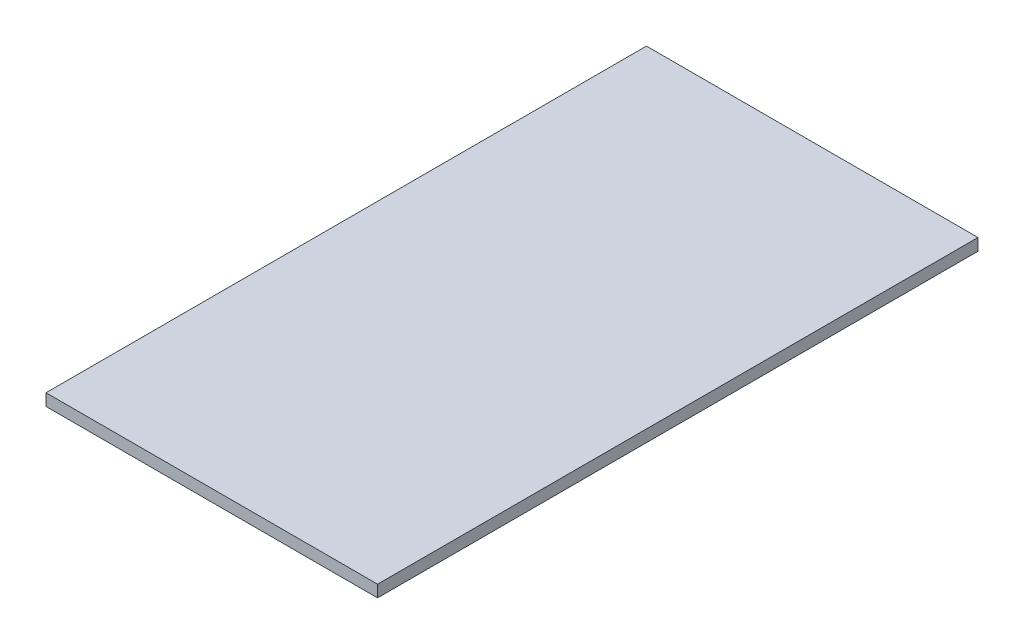
ISO-10303-21;
HEADER;
FILE_DESCRIPTION(('STEP AP214'),'2;1');
FILE_NAME('part.step','',(''),(''),'','','');
FILE_SCHEMA(('AUTOMOTIVE_DESIGN { 1 0 10303 214 1 1 1 1 }'));
ENDSEC;
DATA;
#1=APPLICATION_CONTEXT('core data for automotive mechanical design processes');
#2=APPLICATION_PROTOCOL_DEFINITION('international standard','automotive_design',2000,#1);
#3=PRODUCT_CONTEXT('',#1,'mechanical');
#4=PRODUCT('Part','Part','',(#3));
#5=PRODUCT_RELATED_PRODUCT_CATEGORY('part','',(#4));
#6=PRODUCT_DEFINITION_FORMATION('','',#4);
#7=PRODUCT_DEFINITION_CONTEXT('part definition',#1,'design');
#8=PRODUCT_DEFINITION('design','',#6,#7);
#9=PRODUCT_DEFINITION_SHAPE('','',#8);
#10=(LENGTH_UNIT() NAMED_UNIT(*) SI_UNIT(.MILLI.,.METRE.));
#11=(NAMED_UNIT(*) PLANE_ANGLE_UNIT() SI_UNIT($,.RADIAN.));
#12=(NAMED_UNIT(*) SI_UNIT($,.STERADIAN.) SOLID_ANGLE_UNIT());
#13=UNCERTAINTY_MEASURE_WITH_UNIT(LENGTH_MEASURE(1.E-05),#10,'distance_accuracy_value','');
#14=(GEOMETRIC_REPRESENTATION_CONTEXT(3) GLOBAL_UNCERTAINTY_ASSIGNED_CONTEXT((#13)) GLOBAL_UNIT_ASSIGNED_CONTEXT((#10,
#11,#12)) REPRESENTATION_CONTEXT('',''));
#15=CARTESIAN_POINT('',(0.,0.,0.));
#16=DIRECTION('',(0.,0.,1.));
#17=DIRECTION('',(1.,0.,0.));
#18=AXIS2_PLACEMENT_3D('',#15,#16,#17);
#19=CARTESIAN_POINT('',(0.,3.175,0.));
#20=DIRECTION('',(1.,0.,0.));
#21=DIRECTION('',(0.,0.,-1.));
#22=AXIS2_PLACEMENT_3D('',#19,#20,#21);
#23=PLANE('',#22);
#24=DIRECTION('',(0.,0.,1.));
#25=VECTOR('',#24,1.);
#26=CARTESIAN_POINT('',(0.,0.,0.));
#27=LINE('',#26,#25);
#28=CARTESIAN_POINT('',(0.,0.,-160.));
#29=VERTEX_POINT('',#28);
#30=CARTESIAN_POINT('',(0.,0.,0.));
#31=VERTEX_POINT('',#30);
#32=EDGE_CURVE('E107',#29,#31,#27,.T.);
#33=ORIENTED_EDGE('',*,*,#32,.T.);
#34=DIRECTION('',(0.,-1.,0.));
#35=VECTOR('',#34,1.);
#36=CARTESIAN_POINT('',(0.,3.175,0.));
#37=LINE('',#36,#35);
#38=CARTESIAN_POINT('',(0.,3.175,0.));
#39=VERTEX_POINT('',#38);
#40=EDGE_CURVE('E11',#39,#31,#37,.T.);
#41=ORIENTED_EDGE('',*,*,#40,.F.);
#42=DIRECTION('',(0.,0.,1.));
#43=VECTOR('',#42,1.);
#44=CARTESIAN_POINT('',(0.,3.175,0.));
#45=LINE('',#44,#43);
#46=CARTESIAN_POINT('',(0.,3.175,-160.));
#47=VERTEX_POINT('',#46);
#48=EDGE_CURVE('E91',#47,#39,#45,.T.);
#49=ORIENTED_EDGE('',*,*,#48,.F.);
#50=DIRECTION('',(0.,-1.,0.));
#51=VECTOR('',#50,1.);
#52=CARTESIAN_POINT('',(0.,3.175,-160.));
#53=LINE('',#52,#51);
#54=EDGE_CURVE('E103',#47,#29,#53,.T.);
#55=ORIENTED_EDGE('',*,*,#54,.T.);
#56=EDGE_LOOP('',(#33,#41,#49,#55));
#57=FACE_BOUND('',#56,.T.);
#58=ADVANCED_FACE('F39',(#57),#23,.F.);
#59=CARTESIAN_POINT('',(0.,3.175,0.));
#60=DIRECTION('',(0.,0.,-1.));
#61=DIRECTION('',(-1.,0.,0.));
#62=AXIS2_PLACEMENT_3D('',#59,#60,#61);
#63=PLANE('',#62);
#64=DIRECTION('',(1.,0.,0.));
#65=VECTOR('',#64,1.);
#66=CARTESIAN_POINT('',(0.,0.,0.));
#67=LINE('',#66,#65);
#68=CARTESIAN_POINT('',(88.35,0.,0.));
#69=VERTEX_POINT('',#68);
#70=EDGE_CURVE('E96',#31,#69,#67,.T.);
#71=ORIENTED_EDGE('',*,*,#70,.T.);
#72=DIRECTION('',(0.,-1.,0.));
#73=VECTOR('',#72,1.);
#74=CARTESIAN_POINT('',(88.35,3.175,0.));
#75=LINE('',#74,#73);
#76=CARTESIAN_POINT('',(88.35,3.175,0.));
#77=VERTEX_POINT('',#76);
#78=EDGE_CURVE('E48',#77,#69,#75,.T.);
#79=ORIENTED_EDGE('',*,*,#78,.F.);
#80=DIRECTION('',(1.,0.,0.));
#81=VECTOR('',#80,1.);
#82=CARTESIAN_POINT('',(0.,3.175,0.));
#83=LINE('',#82,#81);
#84=EDGE_CURVE('E86',#39,#77,#83,.T.);
#85=ORIENTED_EDGE('',*,*,#84,.F.);
#86=ORIENTED_EDGE('',*,*,#40,.T.);
#87=EDGE_LOOP('',(#71,#79,#85,#86));
#88=FACE_BOUND('',#87,.T.);
#89=ADVANCED_FACE('F95',(#88),#63,.F.);
#90=CARTESIAN_POINT('',(88.35,3.175,0.));
#91=DIRECTION('',(-1.,0.,0.));
#92=DIRECTION('',(0.,0.,1.));
#93=AXIS2_PLACEMENT_3D('',#90,#91,#92);
#94=PLANE('',#93);
#95=DIRECTION('',(0.,0.,-1.));
#96=VECTOR('',#95,1.);
#97=CARTESIAN_POINT('',(88.35,0.,0.));
#98=LINE('',#97,#96);
#99=CARTESIAN_POINT('',(88.35,0.,-160.));
#100=VERTEX_POINT('',#99);
#101=EDGE_CURVE('E73',#69,#100,#98,.T.);
#102=ORIENTED_EDGE('',*,*,#101,.T.);
#103=DIRECTION('',(0.,-1.,0.));
#104=VECTOR('',#103,1.);
#105=CARTESIAN_POINT('',(88.35,3.175,-160.));
#106=LINE('',#105,#104);
#107=CARTESIAN_POINT('',(88.35,3.175,-160.));
#108=VERTEX_POINT('',#107);
#109=EDGE_CURVE('E98',#108,#100,#106,.T.);
#110=ORIENTED_EDGE('',*,*,#109,.F.);
#111=DIRECTION('',(0.,0.,-1.));
#112=VECTOR('',#111,1.);
#113=CARTESIAN_POINT('',(88.35,3.175,0.));
#114=LINE('',#113,#112);
#115=EDGE_CURVE('E89',#77,#108,#114,.T.);
#116=ORIENTED_EDGE('',*,*,#115,.F.);
#117=ORIENTED_EDGE('',*,*,#78,.T.);
#118=EDGE_LOOP('',(#102,#110,#116,#117));
#119=FACE_BOUND('',#118,.T.);
#120=ADVANCED_FACE('F99',(#119),#94,.F.);
#121=CARTESIAN_POINT('',(0.,3.175,-160.));
#122=DIRECTION('',(0.,0.,1.));
#123=DIRECTION('',(1.,0.,0.));
#124=AXIS2_PLACEMENT_3D('',#121,#122,#123);
#125=PLANE('',#124);
#126=DIRECTION('',(-1.,0.,0.));
#127=VECTOR('',#126,1.);
#128=CARTESIAN_POINT('',(0.,0.,-160.));
#129=LINE('',#128,#127);
#130=EDGE_CURVE('E79',#100,#29,#129,.T.);
#131=ORIENTED_EDGE('',*,*,#130,.T.);
#132=ORIENTED_EDGE('',*,*,#54,.F.);
#133=DIRECTION('',(-1.,0.,0.));
#134=VECTOR('',#133,1.);
#135=CARTESIAN_POINT('',(0.,3.175,-160.));
#136=LINE('',#135,#134);
#137=EDGE_CURVE('E56',#108,#47,#136,.T.);
#138=ORIENTED_EDGE('',*,*,#137,.F.);
#139=ORIENTED_EDGE('',*,*,#109,.T.);
#140=EDGE_LOOP('',(#131,#132,#138,#139));
#141=FACE_BOUND('',#140,.T.);
#142=ADVANCED_FACE('F120',(#141),#125,.F.);
#143=CARTESIAN_POINT('',(0.,3.175,0.));
#144=DIRECTION('',(0.,-1.,0.));
#145=DIRECTION('',(0.,0.,-1.));
#146=AXIS2_PLACEMENT_3D('',#143,#144,#145);
#147=PLANE('',#146);
#148=ORIENTED_EDGE('',*,*,#48,.T.);
#149=ORIENTED_EDGE('',*,*,#84,.T.);
#150=ORIENTED_EDGE('',*,*,#115,.T.);
#151=ORIENTED_EDGE('',*,*,#137,.T.);
#152=EDGE_LOOP('',(#148,#149,#150,#151));
#153=FACE_BOUND('',#152,.T.);
#154=ADVANCED_FACE('F87',(#153),#147,.F.);
#155=CARTESIAN_POINT('',(0.,0.,0.));
#156=DIRECTION('',(0.,-1.,0.));
#157=DIRECTION('',(0.,0.,-1.));
#158=AXIS2_PLACEMENT_3D('',#155,#156,#157);
#159=PLANE('',#158);
#160=ORIENTED_EDGE('',*,*,#32,.F.);
#161=ORIENTED_EDGE('',*,*,#130,.F.);
#162=ORIENTED_EDGE('',*,*,#101,.F.);
#163=ORIENTED_EDGE('',*,*,#70,.F.);
#164=EDGE_LOOP('',(#160,#161,#162,#163));
#165=FACE_BOUND('',#164,.T.);
#166=ADVANCED_FACE('F123',(#165),#159,.T.);
#167=CLOSED_SHELL('',(#58,#89,#120,#142,#154,#166));
#168=MANIFOLD_SOLID_BREP('B2',#167);
#169=ADVANCED_BREP_SHAPE_REPRESENTATION('',(#18,#168),#14);
#170=SHAPE_DEFINITION_REPRESENTATION(#9,#169);
ENDSEC;
END-ISO-10303-21;
